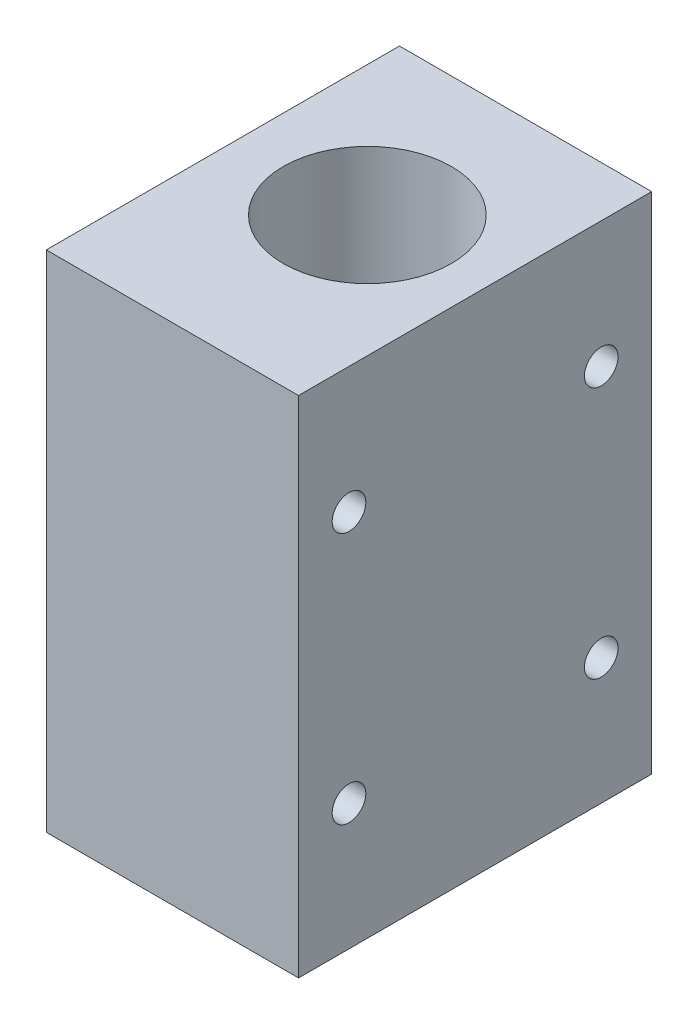
ISO-10303-21;
HEADER;
FILE_DESCRIPTION(('STEP AP214'),'2;1');
FILE_NAME('part.step','',(''),(''),'','','');
FILE_SCHEMA(('AUTOMOTIVE_DESIGN { 1 0 10303 214 1 1 1 1 }'));
ENDSEC;
DATA;
#1=APPLICATION_CONTEXT('core data for automotive mechanical design processes');
#2=APPLICATION_PROTOCOL_DEFINITION('international standard','automotive_design',2000,#1);
#3=PRODUCT_CONTEXT('',#1,'mechanical');
#4=PRODUCT('Part','Part','',(#3));
#5=PRODUCT_RELATED_PRODUCT_CATEGORY('part','',(#4));
#6=PRODUCT_DEFINITION_FORMATION('','',#4);
#7=PRODUCT_DEFINITION_CONTEXT('part definition',#1,'design');
#8=PRODUCT_DEFINITION('design','',#6,#7);
#9=PRODUCT_DEFINITION_SHAPE('','',#8);
#10=(LENGTH_UNIT() NAMED_UNIT(*) SI_UNIT(.MILLI.,.METRE.));
#11=(NAMED_UNIT(*) PLANE_ANGLE_UNIT() SI_UNIT($,.RADIAN.));
#12=(NAMED_UNIT(*) SI_UNIT($,.STERADIAN.) SOLID_ANGLE_UNIT());
#13=UNCERTAINTY_MEASURE_WITH_UNIT(LENGTH_MEASURE(1.E-05),#10,'distance_accuracy_value','');
#14=(GEOMETRIC_REPRESENTATION_CONTEXT(3) GLOBAL_UNCERTAINTY_ASSIGNED_CONTEXT((#13)) GLOBAL_UNIT_ASSIGNED_CONTEXT((#10,
#11,#12)) REPRESENTATION_CONTEXT('',''));
#15=CARTESIAN_POINT('',(0.,0.,0.));
#16=DIRECTION('',(0.,0.,1.));
#17=DIRECTION('',(1.,0.,0.));
#18=AXIS2_PLACEMENT_3D('',#15,#16,#17);
#19=CARTESIAN_POINT('',(30.,0.,0.));
#20=DIRECTION('',(0.,0.,-1.));
#21=DIRECTION('',(-1.,0.,0.));
#22=AXIS2_PLACEMENT_3D('',#19,#20,#21);
#23=PLANE('',#22);
#24=DIRECTION('',(0.,-1.,0.));
#25=VECTOR('',#24,1.);
#26=CARTESIAN_POINT('',(0.,0.,0.));
#27=LINE('',#26,#25);
#28=CARTESIAN_POINT('',(0.,60.,0.));
#29=VERTEX_POINT('',#28);
#30=CARTESIAN_POINT('',(0.,0.,0.));
#31=VERTEX_POINT('',#30);
#32=EDGE_CURVE('E96',#29,#31,#27,.T.);
#33=ORIENTED_EDGE('',*,*,#32,.T.);
#34=DIRECTION('',(-1.,0.,0.));
#35=VECTOR('',#34,1.);
#36=CARTESIAN_POINT('',(30.,0.,0.));
#37=LINE('',#36,#35);
#38=CARTESIAN_POINT('',(30.,0.,0.));
#39=VERTEX_POINT('',#38);
#40=EDGE_CURVE('E11',#39,#31,#37,.T.);
#41=ORIENTED_EDGE('',*,*,#40,.F.);
#42=DIRECTION('',(0.,-1.,0.));
#43=VECTOR('',#42,1.);
#44=CARTESIAN_POINT('',(30.,0.,0.));
#45=LINE('',#44,#43);
#46=CARTESIAN_POINT('',(30.,60.,0.));
#47=VERTEX_POINT('',#46);
#48=EDGE_CURVE('E84',#47,#39,#45,.T.);
#49=ORIENTED_EDGE('',*,*,#48,.F.);
#50=DIRECTION('',(-1.,0.,0.));
#51=VECTOR('',#50,1.);
#52=CARTESIAN_POINT('',(30.,60.,0.));
#53=LINE('',#52,#51);
#54=EDGE_CURVE('E92',#47,#29,#53,.T.);
#55=ORIENTED_EDGE('',*,*,#54,.T.);
#56=EDGE_LOOP('',(#33,#41,#49,#55));
#57=FACE_BOUND('',#56,.T.);
#58=ADVANCED_FACE('F33',(#57),#23,.F.);
#59=CARTESIAN_POINT('',(30.,0.,0.));
#60=DIRECTION('',(0.,1.,0.));
#61=DIRECTION('',(0.,0.,1.));
#62=AXIS2_PLACEMENT_3D('',#59,#60,#61);
#63=PLANE('',#62);
#64=CARTESIAN_POINT('',(15.5,0.,-22.6822665826489));
#65=DIRECTION('',(0.,1.,0.));
#66=DIRECTION('',(0.,0.,1.));
#67=AXIS2_PLACEMENT_3D('',#64,#65,#66);
#68=CIRCLE('',#67,10.);
#69=CARTESIAN_POINT('',(15.5,0.,-12.6822665826489));
#70=VERTEX_POINT('',#69);
#71=EDGE_CURVE('E99',#70,#70,#68,.T.);
#72=ORIENTED_EDGE('',*,*,#71,.T.);
#73=EDGE_LOOP('',(#72));
#74=FACE_BOUND('',#73,.T.);
#75=DIRECTION('',(0.,0.,-1.));
#76=VECTOR('',#75,1.);
#77=CARTESIAN_POINT('',(0.,0.,0.));
#78=LINE('',#77,#76);
#79=CARTESIAN_POINT('',(0.,0.,-42.));
#80=VERTEX_POINT('',#79);
#81=EDGE_CURVE('E88',#31,#80,#78,.T.);
#82=ORIENTED_EDGE('',*,*,#81,.T.);
#83=DIRECTION('',(-1.,0.,0.));
#84=VECTOR('',#83,1.);
#85=CARTESIAN_POINT('',(30.,0.,-42.));
#86=LINE('',#85,#84);
#87=CARTESIAN_POINT('',(30.,0.,-42.));
#88=VERTEX_POINT('',#87);
#89=EDGE_CURVE('E41',#88,#80,#86,.T.);
#90=ORIENTED_EDGE('',*,*,#89,.F.);
#91=DIRECTION('',(0.,0.,-1.));
#92=VECTOR('',#91,1.);
#93=CARTESIAN_POINT('',(30.,0.,0.));
#94=LINE('',#93,#92);
#95=EDGE_CURVE('E79',#39,#88,#94,.T.);
#96=ORIENTED_EDGE('',*,*,#95,.F.);
#97=ORIENTED_EDGE('',*,*,#40,.T.);
#98=EDGE_LOOP('',(#82,#90,#96,#97));
#99=FACE_BOUND('',#98,.T.);
#100=ADVANCED_FACE('F87',(#74,#99),#63,.F.);
#101=CARTESIAN_POINT('',(30.,0.,-42.));
#102=DIRECTION('',(0.,0.,1.));
#103=DIRECTION('',(1.,0.,0.));
#104=AXIS2_PLACEMENT_3D('',#101,#102,#103);
#105=PLANE('',#104);
#106=DIRECTION('',(0.,1.,0.));
#107=VECTOR('',#106,1.);
#108=CARTESIAN_POINT('',(0.,0.,-42.));
#109=LINE('',#108,#107);
#110=CARTESIAN_POINT('',(0.,60.,-42.));
#111=VERTEX_POINT('',#110);
#112=EDGE_CURVE('E66',#80,#111,#109,.T.);
#113=ORIENTED_EDGE('',*,*,#112,.T.);
#114=DIRECTION('',(-1.,0.,0.));
#115=VECTOR('',#114,1.);
#116=CARTESIAN_POINT('',(30.,60.,-42.));
#117=LINE('',#116,#115);
#118=CARTESIAN_POINT('',(30.,60.,-42.));
#119=VERTEX_POINT('',#118);
#120=EDGE_CURVE('E89',#119,#111,#117,.T.);
#121=ORIENTED_EDGE('',*,*,#120,.F.);
#122=DIRECTION('',(0.,1.,0.));
#123=VECTOR('',#122,1.);
#124=CARTESIAN_POINT('',(30.,0.,-42.));
#125=LINE('',#124,#123);
#126=EDGE_CURVE('E82',#88,#119,#125,.T.);
#127=ORIENTED_EDGE('',*,*,#126,.F.);
#128=ORIENTED_EDGE('',*,*,#89,.T.);
#129=EDGE_LOOP('',(#113,#121,#127,#128));
#130=FACE_BOUND('',#129,.T.);
#131=ADVANCED_FACE('F90',(#130),#105,.F.);
#132=CARTESIAN_POINT('',(30.,60.,0.));
#133=DIRECTION('',(0.,-1.,0.));
#134=DIRECTION('',(0.,0.,-1.));
#135=AXIS2_PLACEMENT_3D('',#132,#133,#134);
#136=PLANE('',#135);
#137=CARTESIAN_POINT('',(15.5,60.,-22.6822665826489));
#138=DIRECTION('',(0.,1.,0.));
#139=DIRECTION('',(0.,0.,1.));
#140=AXIS2_PLACEMENT_3D('',#137,#138,#139);
#141=CIRCLE('',#140,10.);
#142=CARTESIAN_POINT('',(15.5,60.,-12.6822665826489));
#143=VERTEX_POINT('',#142);
#144=EDGE_CURVE('E110',#143,#143,#141,.T.);
#145=ORIENTED_EDGE('',*,*,#144,.F.);
#146=EDGE_LOOP('',(#145));
#147=FACE_BOUND('',#146,.T.);
#148=DIRECTION('',(0.,0.,1.));
#149=VECTOR('',#148,1.);
#150=CARTESIAN_POINT('',(0.,60.,0.));
#151=LINE('',#150,#149);
#152=EDGE_CURVE('E72',#111,#29,#151,.T.);
#153=ORIENTED_EDGE('',*,*,#152,.T.);
#154=ORIENTED_EDGE('',*,*,#54,.F.);
#155=DIRECTION('',(0.,0.,1.));
#156=VECTOR('',#155,1.);
#157=CARTESIAN_POINT('',(30.,60.,0.));
#158=LINE('',#157,#156);
#159=EDGE_CURVE('E49',#119,#47,#158,.T.);
#160=ORIENTED_EDGE('',*,*,#159,.F.);
#161=ORIENTED_EDGE('',*,*,#120,.T.);
#162=EDGE_LOOP('',(#153,#154,#160,#161));
#163=FACE_BOUND('',#162,.T.);
#164=ADVANCED_FACE('F104',(#147,#163),#136,.F.);
#165=CARTESIAN_POINT('',(30.,0.,0.));
#166=DIRECTION('',(-1.,0.,0.));
#167=DIRECTION('',(0.,0.,1.));
#168=AXIS2_PLACEMENT_3D('',#165,#166,#167);
#169=PLANE('',#168);
#170=CARTESIAN_POINT('',(30.,15.,-6.00000000000001));
#171=DIRECTION('',(1.,0.,0.));
#172=DIRECTION('',(0.,0.,-1.));
#173=AXIS2_PLACEMENT_3D('',#170,#171,#172);
#174=CIRCLE('',#173,2.);
#175=CARTESIAN_POINT('',(30.,15.,-8.00000000000001));
#176=VERTEX_POINT('',#175);
#177=EDGE_CURVE('E134',#176,#176,#174,.T.);
#178=ORIENTED_EDGE('',*,*,#177,.F.);
#179=EDGE_LOOP('',(#178));
#180=FACE_BOUND('',#179,.T.);
#181=CARTESIAN_POINT('',(30.,15.,-36.));
#182=DIRECTION('',(1.,0.,0.));
#183=DIRECTION('',(0.,0.,-1.));
#184=AXIS2_PLACEMENT_3D('',#181,#182,#183);
#185=CIRCLE('',#184,2.);
#186=CARTESIAN_POINT('',(30.,15.,-38.));
#187=VERTEX_POINT('',#186);
#188=EDGE_CURVE('E128',#187,#187,#185,.T.);
#189=ORIENTED_EDGE('',*,*,#188,.F.);
#190=EDGE_LOOP('',(#189));
#191=FACE_BOUND('',#190,.T.);
#192=CARTESIAN_POINT('',(30.,45.,-36.));
#193=DIRECTION('',(1.,0.,0.));
#194=DIRECTION('',(0.,0.,-1.));
#195=AXIS2_PLACEMENT_3D('',#192,#193,#194);
#196=CIRCLE('',#195,2.);
#197=CARTESIAN_POINT('',(30.,45.,-38.));
#198=VERTEX_POINT('',#197);
#199=EDGE_CURVE('E122',#198,#198,#196,.T.);
#200=ORIENTED_EDGE('',*,*,#199,.F.);
#201=EDGE_LOOP('',(#200));
#202=FACE_BOUND('',#201,.T.);
#203=CARTESIAN_POINT('',(30.,45.,-6.00000000000001));
#204=DIRECTION('',(1.,0.,0.));
#205=DIRECTION('',(0.,0.,-1.));
#206=AXIS2_PLACEMENT_3D('',#203,#204,#205);
#207=CIRCLE('',#206,2.);
#208=CARTESIAN_POINT('',(30.,45.,-8.00000000000001));
#209=VERTEX_POINT('',#208);
#210=EDGE_CURVE('E116',#209,#209,#207,.T.);
#211=ORIENTED_EDGE('',*,*,#210,.F.);
#212=EDGE_LOOP('',(#211));
#213=FACE_BOUND('',#212,.T.);
#214=ORIENTED_EDGE('',*,*,#48,.T.);
#215=ORIENTED_EDGE('',*,*,#95,.T.);
#216=ORIENTED_EDGE('',*,*,#126,.T.);
#217=ORIENTED_EDGE('',*,*,#159,.T.);
#218=EDGE_LOOP('',(#214,#215,#216,#217));
#219=FACE_BOUND('',#218,.T.);
#220=ADVANCED_FACE('F80',(#180,#191,#202,#213,#219),#169,.F.);
#221=CARTESIAN_POINT('',(0.,0.,0.));
#222=DIRECTION('',(-1.,0.,0.));
#223=DIRECTION('',(0.,0.,1.));
#224=AXIS2_PLACEMENT_3D('',#221,#222,#223);
#225=PLANE('',#224);
#226=ORIENTED_EDGE('',*,*,#32,.F.);
#227=ORIENTED_EDGE('',*,*,#152,.F.);
#228=ORIENTED_EDGE('',*,*,#112,.F.);
#229=ORIENTED_EDGE('',*,*,#81,.F.);
#230=EDGE_LOOP('',(#226,#227,#228,#229));
#231=FACE_BOUND('',#230,.T.);
#232=ADVANCED_FACE('F107',(#231),#225,.T.);
#233=CARTESIAN_POINT('',(15.5,0.,-22.6822665826489));
#234=DIRECTION('',(0.,1.,0.));
#235=DIRECTION('',(0.,0.,1.));
#236=AXIS2_PLACEMENT_3D('',#233,#234,#235);
#237=CYLINDRICAL_SURFACE('',#236,10.);
#238=ORIENTED_EDGE('',*,*,#71,.F.);
#239=EDGE_LOOP('',(#238));
#240=FACE_BOUND('',#239,.T.);
#241=ORIENTED_EDGE('',*,*,#144,.T.);
#242=EDGE_LOOP('',(#241));
#243=FACE_BOUND('',#242,.T.);
#244=ADVANCED_FACE('F161',(#240,#243),#237,.F.);
#245=CARTESIAN_POINT('',(20.,45.,-6.00000000000001));
#246=DIRECTION('',(1.,0.,0.));
#247=DIRECTION('',(0.,0.,-1.));
#248=AXIS2_PLACEMENT_3D('',#245,#246,#247);
#249=CYLINDRICAL_SURFACE('',#248,2.);
#250=CARTESIAN_POINT('',(20.,45.,-6.00000000000001));
#251=DIRECTION('',(1.,0.,0.));
#252=DIRECTION('',(0.,0.,-1.));
#253=AXIS2_PLACEMENT_3D('',#250,#251,#252);
#254=CIRCLE('',#253,2.);
#255=CARTESIAN_POINT('',(20.,45.,-8.00000000000001));
#256=VERTEX_POINT('',#255);
#257=EDGE_CURVE('E113',#256,#256,#254,.T.);
#258=ORIENTED_EDGE('',*,*,#257,.F.);
#259=EDGE_LOOP('',(#258));
#260=FACE_BOUND('',#259,.T.);
#261=ORIENTED_EDGE('',*,*,#210,.T.);
#262=EDGE_LOOP('',(#261));
#263=FACE_BOUND('',#262,.T.);
#264=ADVANCED_FACE('F158',(#260,#263),#249,.F.);
#265=CARTESIAN_POINT('',(20.,45.,-6.00000000000001));
#266=DIRECTION('',(1.,0.,0.));
#267=DIRECTION('',(0.,0.,-1.));
#268=AXIS2_PLACEMENT_3D('',#265,#266,#267);
#269=PLANE('',#268);
#270=ORIENTED_EDGE('',*,*,#257,.T.);
#271=EDGE_LOOP('',(#270));
#272=FACE_BOUND('',#271,.T.);
#273=ADVANCED_FACE('F160',(#272),#269,.T.);
#274=CARTESIAN_POINT('',(20.,45.,-36.));
#275=DIRECTION('',(1.,0.,0.));
#276=DIRECTION('',(0.,0.,-1.));
#277=AXIS2_PLACEMENT_3D('',#274,#275,#276);
#278=CYLINDRICAL_SURFACE('',#277,2.);
#279=CARTESIAN_POINT('',(20.,45.,-36.));
#280=DIRECTION('',(1.,0.,0.));
#281=DIRECTION('',(0.,0.,-1.));
#282=AXIS2_PLACEMENT_3D('',#279,#280,#281);
#283=CIRCLE('',#282,2.);
#284=CARTESIAN_POINT('',(20.,45.,-38.));
#285=VERTEX_POINT('',#284);
#286=EDGE_CURVE('E119',#285,#285,#283,.T.);
#287=ORIENTED_EDGE('',*,*,#286,.F.);
#288=EDGE_LOOP('',(#287));
#289=FACE_BOUND('',#288,.T.);
#290=ORIENTED_EDGE('',*,*,#199,.T.);
#291=EDGE_LOOP('',(#290));
#292=FACE_BOUND('',#291,.T.);
#293=ADVANCED_FACE('F168',(#289,#292),#278,.F.);
#294=CARTESIAN_POINT('',(20.,45.,-36.));
#295=DIRECTION('',(1.,0.,0.));
#296=DIRECTION('',(0.,0.,-1.));
#297=AXIS2_PLACEMENT_3D('',#294,#295,#296);
#298=PLANE('',#297);
#299=ORIENTED_EDGE('',*,*,#286,.T.);
#300=EDGE_LOOP('',(#299));
#301=FACE_BOUND('',#300,.T.);
#302=ADVANCED_FACE('F223',(#301),#298,.T.);
#303=CARTESIAN_POINT('',(20.,15.,-36.));
#304=DIRECTION('',(1.,0.,0.));
#305=DIRECTION('',(0.,0.,-1.));
#306=AXIS2_PLACEMENT_3D('',#303,#304,#305);
#307=CYLINDRICAL_SURFACE('',#306,2.);
#308=CARTESIAN_POINT('',(20.,15.,-36.));
#309=DIRECTION('',(1.,0.,0.));
#310=DIRECTION('',(0.,0.,-1.));
#311=AXIS2_PLACEMENT_3D('',#308,#309,#310);
#312=CIRCLE('',#311,2.);
#313=CARTESIAN_POINT('',(20.,15.,-38.));
#314=VERTEX_POINT('',#313);
#315=EDGE_CURVE('E125',#314,#314,#312,.T.);
#316=ORIENTED_EDGE('',*,*,#315,.F.);
#317=EDGE_LOOP('',(#316));
#318=FACE_BOUND('',#317,.T.);
#319=ORIENTED_EDGE('',*,*,#188,.T.);
#320=EDGE_LOOP('',(#319));
#321=FACE_BOUND('',#320,.T.);
#322=ADVANCED_FACE('F233',(#318,#321),#307,.F.);
#323=CARTESIAN_POINT('',(20.,15.,-36.));
#324=DIRECTION('',(1.,0.,0.));
#325=DIRECTION('',(0.,0.,-1.));
#326=AXIS2_PLACEMENT_3D('',#323,#324,#325);
#327=PLANE('',#326);
#328=ORIENTED_EDGE('',*,*,#315,.T.);
#329=EDGE_LOOP('',(#328));
#330=FACE_BOUND('',#329,.T.);
#331=ADVANCED_FACE('F145',(#330),#327,.T.);
#332=CARTESIAN_POINT('',(20.,15.,-6.00000000000001));
#333=DIRECTION('',(1.,0.,0.));
#334=DIRECTION('',(0.,0.,-1.));
#335=AXIS2_PLACEMENT_3D('',#332,#333,#334);
#336=CYLINDRICAL_SURFACE('',#335,2.);
#337=CARTESIAN_POINT('',(20.,15.,-6.00000000000001));
#338=DIRECTION('',(1.,0.,0.));
#339=DIRECTION('',(0.,0.,-1.));
#340=AXIS2_PLACEMENT_3D('',#337,#338,#339);
#341=CIRCLE('',#340,2.);
#342=CARTESIAN_POINT('',(20.,15.,-8.00000000000001));
#343=VERTEX_POINT('',#342);
#344=EDGE_CURVE('E131',#343,#343,#341,.T.);
#345=ORIENTED_EDGE('',*,*,#344,.F.);
#346=EDGE_LOOP('',(#345));
#347=FACE_BOUND('',#346,.T.);
#348=ORIENTED_EDGE('',*,*,#177,.T.);
#349=EDGE_LOOP('',(#348));
#350=FACE_BOUND('',#349,.T.);
#351=ADVANCED_FACE('F142',(#347,#350),#336,.F.);
#352=CARTESIAN_POINT('',(20.,15.,-6.00000000000001));
#353=DIRECTION('',(1.,0.,0.));
#354=DIRECTION('',(0.,0.,-1.));
#355=AXIS2_PLACEMENT_3D('',#352,#353,#354);
#356=PLANE('',#355);
#357=ORIENTED_EDGE('',*,*,#344,.T.);
#358=EDGE_LOOP('',(#357));
#359=FACE_BOUND('',#358,.T.);
#360=ADVANCED_FACE('F140',(#359),#356,.T.);
#361=CLOSED_SHELL('',(#58,#100,#131,#164,#220,#232,#244,#264,#273,#293,#302,#322,#331,#351,#360));
#362=MANIFOLD_SOLID_BREP('B2',#361);
#363=ADVANCED_BREP_SHAPE_REPRESENTATION('',(#18,#362),#14);
#364=SHAPE_DEFINITION_REPRESENTATION(#9,#363);
ENDSEC;
END-ISO-10303-21;
